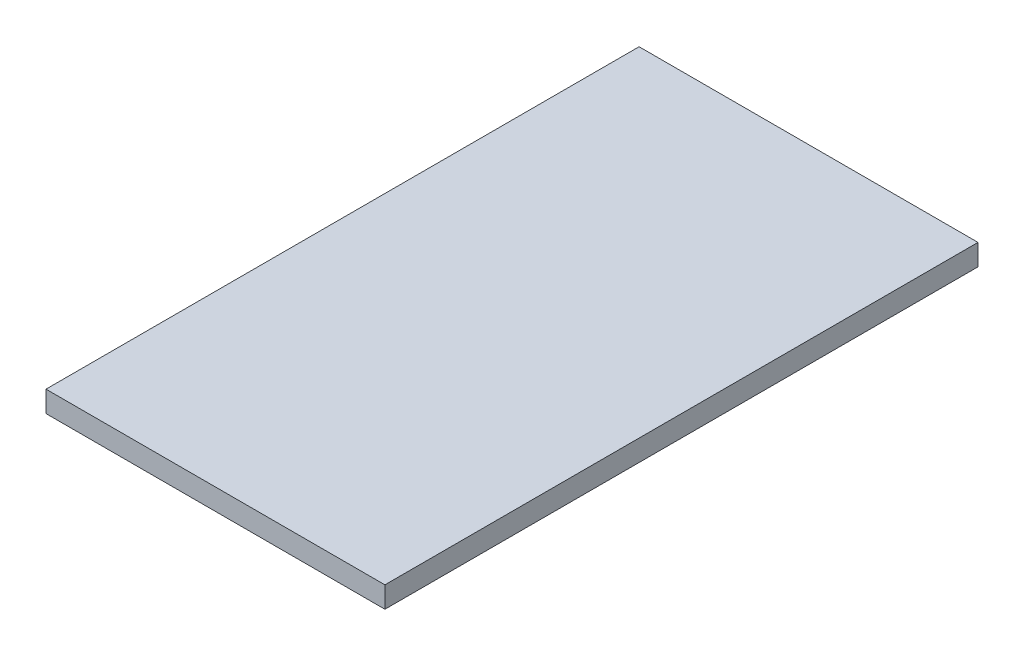
ISO-10303-21;
HEADER;
FILE_DESCRIPTION(('STEP AP214'),'2;1');
FILE_NAME('part.step','',(''),(''),'','','');
FILE_SCHEMA(('AUTOMOTIVE_DESIGN { 1 0 10303 214 1 1 1 1 }'));
ENDSEC;
DATA;
#1=APPLICATION_CONTEXT('core data for automotive mechanical design processes');
#2=APPLICATION_PROTOCOL_DEFINITION('international standard','automotive_design',2000,#1);
#3=PRODUCT_CONTEXT('',#1,'mechanical');
#4=PRODUCT('Part','Part','',(#3));
#5=PRODUCT_RELATED_PRODUCT_CATEGORY('part','',(#4));
#6=PRODUCT_DEFINITION_FORMATION('','',#4);
#7=PRODUCT_DEFINITION_CONTEXT('part definition',#1,'design');
#8=PRODUCT_DEFINITION('design','',#6,#7);
#9=PRODUCT_DEFINITION_SHAPE('','',#8);
#10=(LENGTH_UNIT() NAMED_UNIT(*) SI_UNIT(.MILLI.,.METRE.));
#11=(NAMED_UNIT(*) PLANE_ANGLE_UNIT() SI_UNIT($,.RADIAN.));
#12=(NAMED_UNIT(*) SI_UNIT($,.STERADIAN.) SOLID_ANGLE_UNIT());
#13=UNCERTAINTY_MEASURE_WITH_UNIT(LENGTH_MEASURE(1.E-05),#10,'distance_accuracy_value','');
#14=(GEOMETRIC_REPRESENTATION_CONTEXT(3) GLOBAL_UNCERTAINTY_ASSIGNED_CONTEXT((#13)) GLOBAL_UNIT_ASSIGNED_CONTEXT((#10,
#11,#12)) REPRESENTATION_CONTEXT('',''));
#15=CARTESIAN_POINT('',(0.,0.,0.));
#16=DIRECTION('',(0.,0.,1.));
#17=DIRECTION('',(1.,0.,0.));
#18=AXIS2_PLACEMENT_3D('',#15,#16,#17);
#19=CARTESIAN_POINT('',(0.,19.05,0.));
#20=DIRECTION('',(1.,0.,0.));
#21=DIRECTION('',(0.,0.,-1.));
#22=AXIS2_PLACEMENT_3D('',#19,#20,#21);
#23=PLANE('',#22);
#24=DIRECTION('',(0.,0.,1.));
#25=VECTOR('',#24,1.);
#26=CARTESIAN_POINT('',(0.,0.,0.));
#27=LINE('',#26,#25);
#28=CARTESIAN_POINT('',(0.,0.,-533.4));
#29=VERTEX_POINT('',#28);
#30=CARTESIAN_POINT('',(0.,0.,0.));
#31=VERTEX_POINT('',#30);
#32=EDGE_CURVE('E96',#29,#31,#27,.T.);
#33=ORIENTED_EDGE('',*,*,#32,.T.);
#34=DIRECTION('',(0.,-1.,0.));
#35=VECTOR('',#34,1.);
#36=CARTESIAN_POINT('',(0.,19.05,0.));
#37=LINE('',#36,#35);
#38=CARTESIAN_POINT('',(0.,19.05,0.));
#39=VERTEX_POINT('',#38);
#40=EDGE_CURVE('E11',#39,#31,#37,.T.);
#41=ORIENTED_EDGE('',*,*,#40,.F.);
#42=DIRECTION('',(0.,0.,1.));
#43=VECTOR('',#42,1.);
#44=CARTESIAN_POINT('',(0.,19.05,0.));
#45=LINE('',#44,#43);
#46=CARTESIAN_POINT('',(0.,19.05,-533.4));
#47=VERTEX_POINT('',#46);
#48=EDGE_CURVE('E84',#47,#39,#45,.T.);
#49=ORIENTED_EDGE('',*,*,#48,.F.);
#50=DIRECTION('',(0.,-1.,0.));
#51=VECTOR('',#50,1.);
#52=CARTESIAN_POINT('',(0.,19.05,-533.4));
#53=LINE('',#52,#51);
#54=EDGE_CURVE('E92',#47,#29,#53,.T.);
#55=ORIENTED_EDGE('',*,*,#54,.T.);
#56=EDGE_LOOP('',(#33,#41,#49,#55));
#57=FACE_BOUND('',#56,.T.);
#58=ADVANCED_FACE('F33',(#57),#23,.F.);
#59=CARTESIAN_POINT('',(0.,19.05,0.));
#60=DIRECTION('',(0.,0.,-1.));
#61=DIRECTION('',(-1.,0.,0.));
#62=AXIS2_PLACEMENT_3D('',#59,#60,#61);
#63=PLANE('',#62);
#64=DIRECTION('',(1.,0.,0.));
#65=VECTOR('',#64,1.);
#66=CARTESIAN_POINT('',(0.,0.,0.));
#67=LINE('',#66,#65);
#68=CARTESIAN_POINT('',(304.8,0.,0.));
#69=VERTEX_POINT('',#68);
#70=EDGE_CURVE('E88',#31,#69,#67,.T.);
#71=ORIENTED_EDGE('',*,*,#70,.T.);
#72=DIRECTION('',(0.,-1.,0.));
#73=VECTOR('',#72,1.);
#74=CARTESIAN_POINT('',(304.8,19.05,0.));
#75=LINE('',#74,#73);
#76=CARTESIAN_POINT('',(304.8,19.05,0.));
#77=VERTEX_POINT('',#76);
#78=EDGE_CURVE('E41',#77,#69,#75,.T.);
#79=ORIENTED_EDGE('',*,*,#78,.F.);
#80=DIRECTION('',(1.,0.,0.));
#81=VECTOR('',#80,1.);
#82=CARTESIAN_POINT('',(0.,19.05,0.));
#83=LINE('',#82,#81);
#84=EDGE_CURVE('E79',#39,#77,#83,.T.);
#85=ORIENTED_EDGE('',*,*,#84,.F.);
#86=ORIENTED_EDGE('',*,*,#40,.T.);
#87=EDGE_LOOP('',(#71,#79,#85,#86));
#88=FACE_BOUND('',#87,.T.);
#89=ADVANCED_FACE('F87',(#88),#63,.F.);
#90=CARTESIAN_POINT('',(304.8,19.05,0.));
#91=DIRECTION('',(-1.,0.,0.));
#92=DIRECTION('',(0.,0.,1.));
#93=AXIS2_PLACEMENT_3D('',#90,#91,#92);
#94=PLANE('',#93);
#95=DIRECTION('',(0.,0.,-1.));
#96=VECTOR('',#95,1.);
#97=CARTESIAN_POINT('',(304.8,0.,0.));
#98=LINE('',#97,#96);
#99=CARTESIAN_POINT('',(304.8,0.,-533.4));
#100=VERTEX_POINT('',#99);
#101=EDGE_CURVE('E66',#69,#100,#98,.T.);
#102=ORIENTED_EDGE('',*,*,#101,.T.);
#103=DIRECTION('',(0.,-1.,0.));
#104=VECTOR('',#103,1.);
#105=CARTESIAN_POINT('',(304.8,19.05,-533.4));
#106=LINE('',#105,#104);
#107=CARTESIAN_POINT('',(304.8,19.05,-533.4));
#108=VERTEX_POINT('',#107);
#109=EDGE_CURVE('E89',#108,#100,#106,.T.);
#110=ORIENTED_EDGE('',*,*,#109,.F.);
#111=DIRECTION('',(0.,0.,-1.));
#112=VECTOR('',#111,1.);
#113=CARTESIAN_POINT('',(304.8,19.05,0.));
#114=LINE('',#113,#112);
#115=EDGE_CURVE('E82',#77,#108,#114,.T.);
#116=ORIENTED_EDGE('',*,*,#115,.F.);
#117=ORIENTED_EDGE('',*,*,#78,.T.);
#118=EDGE_LOOP('',(#102,#110,#116,#117));
#119=FACE_BOUND('',#118,.T.);
#120=ADVANCED_FACE('F90',(#119),#94,.F.);
#121=CARTESIAN_POINT('',(0.,19.05,-533.4));
#122=DIRECTION('',(0.,0.,1.));
#123=DIRECTION('',(1.,0.,0.));
#124=AXIS2_PLACEMENT_3D('',#121,#122,#123);
#125=PLANE('',#124);
#126=DIRECTION('',(-1.,0.,0.));
#127=VECTOR('',#126,1.);
#128=CARTESIAN_POINT('',(0.,0.,-533.4));
#129=LINE('',#128,#127);
#130=EDGE_CURVE('E72',#100,#29,#129,.T.);
#131=ORIENTED_EDGE('',*,*,#130,.T.);
#132=ORIENTED_EDGE('',*,*,#54,.F.);
#133=DIRECTION('',(-1.,0.,0.));
#134=VECTOR('',#133,1.);
#135=CARTESIAN_POINT('',(0.,19.05,-533.4));
#136=LINE('',#135,#134);
#137=EDGE_CURVE('E49',#108,#47,#136,.T.);
#138=ORIENTED_EDGE('',*,*,#137,.F.);
#139=ORIENTED_EDGE('',*,*,#109,.T.);
#140=EDGE_LOOP('',(#131,#132,#138,#139));
#141=FACE_BOUND('',#140,.T.);
#142=ADVANCED_FACE('F103',(#141),#125,.F.);
#143=CARTESIAN_POINT('',(0.,19.05,0.));
#144=DIRECTION('',(0.,-1.,0.));
#145=DIRECTION('',(0.,0.,-1.));
#146=AXIS2_PLACEMENT_3D('',#143,#144,#145);
#147=PLANE('',#146);
#148=ORIENTED_EDGE('',*,*,#48,.T.);
#149=ORIENTED_EDGE('',*,*,#84,.T.);
#150=ORIENTED_EDGE('',*,*,#115,.T.);
#151=ORIENTED_EDGE('',*,*,#137,.T.);
#152=EDGE_LOOP('',(#148,#149,#150,#151));
#153=FACE_BOUND('',#152,.T.);
#154=ADVANCED_FACE('F80',(#153),#147,.F.);
#155=CARTESIAN_POINT('',(0.,0.,0.));
#156=DIRECTION('',(0.,-1.,0.));
#157=DIRECTION('',(0.,0.,-1.));
#158=AXIS2_PLACEMENT_3D('',#155,#156,#157);
#159=PLANE('',#158);
#160=ORIENTED_EDGE('',*,*,#32,.F.);
#161=ORIENTED_EDGE('',*,*,#130,.F.);
#162=ORIENTED_EDGE('',*,*,#101,.F.);
#163=ORIENTED_EDGE('',*,*,#70,.F.);
#164=EDGE_LOOP('',(#160,#161,#162,#163));
#165=FACE_BOUND('',#164,.T.);
#166=ADVANCED_FACE('F106',(#165),#159,.T.);
#167=CLOSED_SHELL('',(#58,#89,#120,#142,#154,#166));
#168=MANIFOLD_SOLID_BREP('B2',#167);
#169=ADVANCED_BREP_SHAPE_REPRESENTATION('',(#18,#168),#14);
#170=SHAPE_DEFINITION_REPRESENTATION(#9,#169);
ENDSEC;
END-ISO-10303-21;
